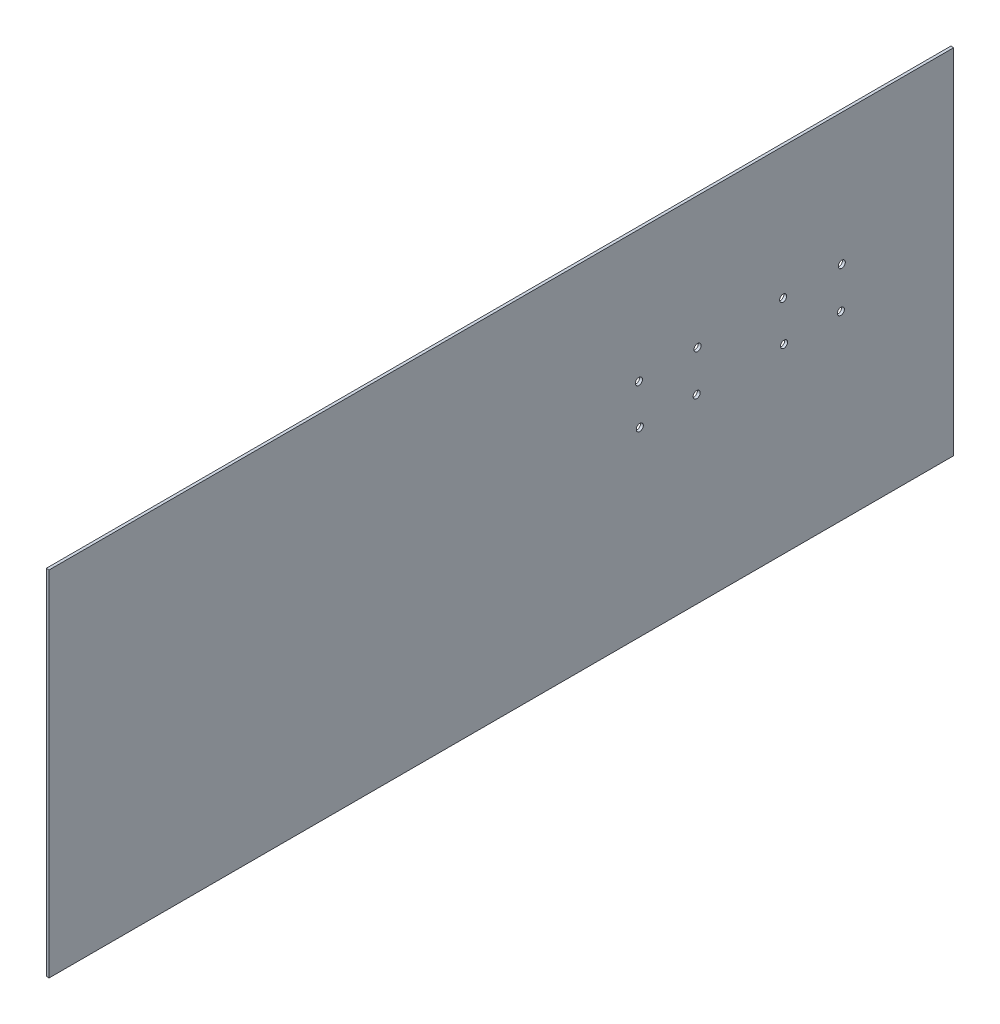
ISO-10303-21;
HEADER;
FILE_DESCRIPTION(('STEP AP214'),'2;1');
FILE_NAME('part.step','',(''),(''),'','','');
FILE_SCHEMA(('AUTOMOTIVE_DESIGN { 1 0 10303 214 1 1 1 1 }'));
ENDSEC;
DATA;
#1=APPLICATION_CONTEXT('core data for automotive mechanical design processes');
#2=APPLICATION_PROTOCOL_DEFINITION('international standard','automotive_design',2000,#1);
#3=PRODUCT_CONTEXT('',#1,'mechanical');
#4=PRODUCT('Part','Part','',(#3));
#5=PRODUCT_RELATED_PRODUCT_CATEGORY('part','',(#4));
#6=PRODUCT_DEFINITION_FORMATION('','',#4);
#7=PRODUCT_DEFINITION_CONTEXT('part definition',#1,'design');
#8=PRODUCT_DEFINITION('design','',#6,#7);
#9=PRODUCT_DEFINITION_SHAPE('','',#8);
#10=(LENGTH_UNIT() NAMED_UNIT(*) SI_UNIT(.MILLI.,.METRE.));
#11=(NAMED_UNIT(*) PLANE_ANGLE_UNIT() SI_UNIT($,.RADIAN.));
#12=(NAMED_UNIT(*) SI_UNIT($,.STERADIAN.) SOLID_ANGLE_UNIT());
#13=UNCERTAINTY_MEASURE_WITH_UNIT(LENGTH_MEASURE(1.E-05),#10,'distance_accuracy_value','');
#14=(GEOMETRIC_REPRESENTATION_CONTEXT(3) GLOBAL_UNCERTAINTY_ASSIGNED_CONTEXT((#13)) GLOBAL_UNIT_ASSIGNED_CONTEXT((#10,
#11,#12)) REPRESENTATION_CONTEXT('',''));
#15=CARTESIAN_POINT('',(0.,0.,0.));
#16=DIRECTION('',(0.,0.,1.));
#17=DIRECTION('',(1.,0.,0.));
#18=AXIS2_PLACEMENT_3D('',#15,#16,#17);
#19=CARTESIAN_POINT('',(2.,0.,0.));
#20=DIRECTION('',(1.,0.,0.));
#21=DIRECTION('',(0.,0.,-1.));
#22=AXIS2_PLACEMENT_3D('',#19,#20,#21);
#23=PLANE('',#22);
#24=CARTESIAN_POINT('',(2.,14.0702412568172,-241.389936391471));
#25=DIRECTION('',(1.,0.,0.));
#26=DIRECTION('',(0.,0.,-1.));
#27=AXIS2_PLACEMENT_3D('',#24,#25,#26);
#28=CIRCLE('',#27,2.5);
#29=CARTESIAN_POINT('',(2.,14.0702412568172,-243.889936391471));
#30=VERTEX_POINT('',#29);
#31=EDGE_CURVE('E145',#30,#30,#28,.T.);
#32=ORIENTED_EDGE('',*,*,#31,.F.);
#33=EDGE_LOOP('',(#32));
#34=FACE_BOUND('',#33,.T.);
#35=CARTESIAN_POINT('',(2.,42.6102412568172,-200.545763818368));
#36=DIRECTION('',(1.,0.,0.));
#37=DIRECTION('',(0.,0.,-1.));
#38=AXIS2_PLACEMENT_3D('',#35,#36,#37);
#39=CIRCLE('',#38,2.5);
#40=CARTESIAN_POINT('',(2.,42.6102412568172,-203.045763818368));
#41=VERTEX_POINT('',#40);
#42=EDGE_CURVE('E133',#41,#41,#39,.T.);
#43=ORIENTED_EDGE('',*,*,#42,.F.);
#44=EDGE_LOOP('',(#43));
#45=FACE_BOUND('',#44,.T.);
#46=CARTESIAN_POINT('',(2.,14.0702412568178,-99.1462512423402));
#47=DIRECTION('',(1.,0.,0.));
#48=DIRECTION('',(0.,0.,-1.));
#49=AXIS2_PLACEMENT_3D('',#46,#47,#48);
#50=CIRCLE('',#49,2.50000000000001);
#51=CARTESIAN_POINT('',(2.,14.0702412568178,-101.64625124234));
#52=VERTEX_POINT('',#51);
#53=EDGE_CURVE('E121',#52,#52,#50,.T.);
#54=ORIENTED_EDGE('',*,*,#53,.F.);
#55=EDGE_LOOP('',(#54));
#56=FACE_BOUND('',#55,.T.);
#57=CARTESIAN_POINT('',(2.,42.6102412568178,-98.5187323569636));
#58=DIRECTION('',(1.,0.,0.));
#59=DIRECTION('',(0.,0.,-1.));
#60=AXIS2_PLACEMENT_3D('',#57,#58,#59);
#61=CIRCLE('',#60,2.5);
#62=CARTESIAN_POINT('',(2.,42.6102412568178,-101.018732356964));
#63=VERTEX_POINT('',#62);
#64=EDGE_CURVE('E100',#63,#63,#61,.T.);
#65=ORIENTED_EDGE('',*,*,#64,.F.);
#66=EDGE_LOOP('',(#65));
#67=FACE_BOUND('',#66,.T.);
#68=DIRECTION('',(0.,-1.,0.));
#69=VECTOR('',#68,1.);
#70=CARTESIAN_POINT('',(2.,135.719844357977,318.75486381323));
#71=LINE('',#70,#69);
#72=CARTESIAN_POINT('',(2.,135.719844357977,318.75486381323));
#73=VERTEX_POINT('',#72);
#74=CARTESIAN_POINT('',(2.,-114.280155642023,318.75486381323));
#75=VERTEX_POINT('',#74);
#76=EDGE_CURVE('E85',#73,#75,#71,.T.);
#77=ORIENTED_EDGE('',*,*,#76,.T.);
#78=DIRECTION('',(0.,0.,-1.));
#79=VECTOR('',#78,1.);
#80=CARTESIAN_POINT('',(2.,-114.280155642023,318.75486381323));
#81=LINE('',#80,#79);
#82=CARTESIAN_POINT('',(2.,-114.280155642023,-321.24513618677));
#83=VERTEX_POINT('',#82);
#84=EDGE_CURVE('E80',#75,#83,#81,.T.);
#85=ORIENTED_EDGE('',*,*,#84,.T.);
#86=DIRECTION('',(0.,1.,0.));
#87=VECTOR('',#86,1.);
#88=CARTESIAN_POINT('',(2.,135.719844357977,-321.24513618677));
#89=LINE('',#88,#87);
#90=CARTESIAN_POINT('',(2.,135.719844357977,-321.24513618677));
#91=VERTEX_POINT('',#90);
#92=EDGE_CURVE('E83',#83,#91,#89,.T.);
#93=ORIENTED_EDGE('',*,*,#92,.T.);
#94=DIRECTION('',(0.,0.,1.));
#95=VECTOR('',#94,1.);
#96=CARTESIAN_POINT('',(2.,135.719844357977,318.75486381323));
#97=LINE('',#96,#95);
#98=EDGE_CURVE('E50',#91,#73,#97,.T.);
#99=ORIENTED_EDGE('',*,*,#98,.T.);
#100=EDGE_LOOP('',(#77,#85,#93,#99));
#101=FACE_BOUND('',#100,.T.);
#102=CARTESIAN_POINT('',(2.,42.6102412568178,-140.009766973042));
#103=DIRECTION('',(1.,0.,0.));
#104=DIRECTION('',(0.,0.,-1.));
#105=AXIS2_PLACEMENT_3D('',#102,#103,#104);
#106=CIRCLE('',#105,2.5);
#107=CARTESIAN_POINT('',(2.,42.6102412568178,-142.509766973042));
#108=VERTEX_POINT('',#107);
#109=EDGE_CURVE('E115',#108,#108,#106,.T.);
#110=ORIENTED_EDGE('',*,*,#109,.F.);
#111=EDGE_LOOP('',(#110));
#112=FACE_BOUND('',#111,.T.);
#113=CARTESIAN_POINT('',(2.,14.0702412568178,-139.362904930067));
#114=DIRECTION('',(1.,0.,0.));
#115=DIRECTION('',(0.,0.,-1.));
#116=AXIS2_PLACEMENT_3D('',#113,#114,#115);
#117=CIRCLE('',#116,2.5);
#118=CARTESIAN_POINT('',(2.,14.0702412568178,-141.862904930067));
#119=VERTEX_POINT('',#118);
#120=EDGE_CURVE('E127',#119,#119,#117,.T.);
#121=ORIENTED_EDGE('',*,*,#120,.F.);
#122=EDGE_LOOP('',(#121));
#123=FACE_BOUND('',#122,.T.);
#124=CARTESIAN_POINT('',(2.,14.0702412568172,-201.173282703744));
#125=DIRECTION('',(1.,0.,0.));
#126=DIRECTION('',(0.,0.,-1.));
#127=AXIS2_PLACEMENT_3D('',#124,#125,#126);
#128=CIRCLE('',#127,2.49999999999997);
#129=CARTESIAN_POINT('',(2.,14.0702412568172,-203.673282703744));
#130=VERTEX_POINT('',#129);
#131=EDGE_CURVE('E139',#130,#130,#128,.T.);
#132=ORIENTED_EDGE('',*,*,#131,.F.);
#133=EDGE_LOOP('',(#132));
#134=FACE_BOUND('',#133,.T.);
#135=CARTESIAN_POINT('',(2.,42.6102412568172,-242.036798434446));
#136=DIRECTION('',(1.,0.,0.));
#137=DIRECTION('',(0.,0.,-1.));
#138=AXIS2_PLACEMENT_3D('',#135,#136,#137);
#139=CIRCLE('',#138,2.5);
#140=CARTESIAN_POINT('',(2.,42.6102412568172,-244.536798434446));
#141=VERTEX_POINT('',#140);
#142=EDGE_CURVE('E151',#141,#141,#139,.T.);
#143=ORIENTED_EDGE('',*,*,#142,.F.);
#144=EDGE_LOOP('',(#143));
#145=FACE_BOUND('',#144,.T.);
#146=ADVANCED_FACE('F33',(#34,#45,#56,#67,#101,#112,#123,#134,#145),#23,.T.);
#147=CARTESIAN_POINT('',(0.,0.,0.));
#148=DIRECTION('',(1.,0.,0.));
#149=DIRECTION('',(0.,0.,-1.));
#150=AXIS2_PLACEMENT_3D('',#147,#148,#149);
#151=PLANE('',#150);
#152=DIRECTION('',(0.,-1.,0.));
#153=VECTOR('',#152,1.);
#154=CARTESIAN_POINT('',(0.,135.719844357977,318.75486381323));
#155=LINE('',#154,#153);
#156=CARTESIAN_POINT('',(0.,135.719844357977,318.75486381323));
#157=VERTEX_POINT('',#156);
#158=CARTESIAN_POINT('',(0.,-114.280155642023,318.75486381323));
#159=VERTEX_POINT('',#158);
#160=EDGE_CURVE('E97',#157,#159,#155,.T.);
#161=ORIENTED_EDGE('',*,*,#160,.F.);
#162=DIRECTION('',(0.,0.,1.));
#163=VECTOR('',#162,1.);
#164=CARTESIAN_POINT('',(0.,135.719844357977,318.75486381323));
#165=LINE('',#164,#163);
#166=CARTESIAN_POINT('',(0.,135.719844357977,-321.24513618677));
#167=VERTEX_POINT('',#166);
#168=EDGE_CURVE('E73',#167,#157,#165,.T.);
#169=ORIENTED_EDGE('',*,*,#168,.F.);
#170=DIRECTION('',(0.,1.,0.));
#171=VECTOR('',#170,1.);
#172=CARTESIAN_POINT('',(0.,135.719844357977,-321.24513618677));
#173=LINE('',#172,#171);
#174=CARTESIAN_POINT('',(0.,-114.280155642023,-321.24513618677));
#175=VERTEX_POINT('',#174);
#176=EDGE_CURVE('E67',#175,#167,#173,.T.);
#177=ORIENTED_EDGE('',*,*,#176,.F.);
#178=DIRECTION('',(0.,0.,-1.));
#179=VECTOR('',#178,1.);
#180=CARTESIAN_POINT('',(0.,-114.280155642023,318.75486381323));
#181=LINE('',#180,#179);
#182=EDGE_CURVE('E89',#159,#175,#181,.T.);
#183=ORIENTED_EDGE('',*,*,#182,.F.);
#184=EDGE_LOOP('',(#161,#169,#177,#183));
#185=FACE_BOUND('',#184,.T.);
#186=CARTESIAN_POINT('',(0.,42.6102412568178,-98.5187323569636));
#187=DIRECTION('',(1.,0.,0.));
#188=DIRECTION('',(0.,0.,-1.));
#189=AXIS2_PLACEMENT_3D('',#186,#187,#188);
#190=CIRCLE('',#189,2.5);
#191=CARTESIAN_POINT('',(0.,42.6102412568178,-101.018732356964));
#192=VERTEX_POINT('',#191);
#193=EDGE_CURVE('E112',#192,#192,#190,.T.);
#194=ORIENTED_EDGE('',*,*,#193,.T.);
#195=EDGE_LOOP('',(#194));
#196=FACE_BOUND('',#195,.T.);
#197=CARTESIAN_POINT('',(0.,42.6102412568178,-140.009766973042));
#198=DIRECTION('',(1.,0.,0.));
#199=DIRECTION('',(0.,0.,-1.));
#200=AXIS2_PLACEMENT_3D('',#197,#198,#199);
#201=CIRCLE('',#200,2.5);
#202=CARTESIAN_POINT('',(0.,42.6102412568178,-142.509766973042));
#203=VERTEX_POINT('',#202);
#204=EDGE_CURVE('E118',#203,#203,#201,.T.);
#205=ORIENTED_EDGE('',*,*,#204,.T.);
#206=EDGE_LOOP('',(#205));
#207=FACE_BOUND('',#206,.T.);
#208=CARTESIAN_POINT('',(0.,14.0702412568178,-99.1462512423402));
#209=DIRECTION('',(1.,0.,0.));
#210=DIRECTION('',(0.,0.,-1.));
#211=AXIS2_PLACEMENT_3D('',#208,#209,#210);
#212=CIRCLE('',#211,2.50000000000001);
#213=CARTESIAN_POINT('',(0.,14.0702412568178,-101.64625124234));
#214=VERTEX_POINT('',#213);
#215=EDGE_CURVE('E124',#214,#214,#212,.T.);
#216=ORIENTED_EDGE('',*,*,#215,.T.);
#217=EDGE_LOOP('',(#216));
#218=FACE_BOUND('',#217,.T.);
#219=CARTESIAN_POINT('',(0.,14.0702412568178,-139.362904930067));
#220=DIRECTION('',(1.,0.,0.));
#221=DIRECTION('',(0.,0.,-1.));
#222=AXIS2_PLACEMENT_3D('',#219,#220,#221);
#223=CIRCLE('',#222,2.5);
#224=CARTESIAN_POINT('',(0.,14.0702412568178,-141.862904930067));
#225=VERTEX_POINT('',#224);
#226=EDGE_CURVE('E130',#225,#225,#223,.T.);
#227=ORIENTED_EDGE('',*,*,#226,.T.);
#228=EDGE_LOOP('',(#227));
#229=FACE_BOUND('',#228,.T.);
#230=CARTESIAN_POINT('',(0.,42.6102412568172,-200.545763818368));
#231=DIRECTION('',(1.,0.,0.));
#232=DIRECTION('',(0.,0.,-1.));
#233=AXIS2_PLACEMENT_3D('',#230,#231,#232);
#234=CIRCLE('',#233,2.5);
#235=CARTESIAN_POINT('',(0.,42.6102412568172,-203.045763818368));
#236=VERTEX_POINT('',#235);
#237=EDGE_CURVE('E136',#236,#236,#234,.T.);
#238=ORIENTED_EDGE('',*,*,#237,.T.);
#239=EDGE_LOOP('',(#238));
#240=FACE_BOUND('',#239,.T.);
#241=CARTESIAN_POINT('',(0.,14.0702412568172,-201.173282703744));
#242=DIRECTION('',(1.,0.,0.));
#243=DIRECTION('',(0.,0.,-1.));
#244=AXIS2_PLACEMENT_3D('',#241,#242,#243);
#245=CIRCLE('',#244,2.49999999999997);
#246=CARTESIAN_POINT('',(0.,14.0702412568172,-203.673282703744));
#247=VERTEX_POINT('',#246);
#248=EDGE_CURVE('E142',#247,#247,#245,.T.);
#249=ORIENTED_EDGE('',*,*,#248,.T.);
#250=EDGE_LOOP('',(#249));
#251=FACE_BOUND('',#250,.T.);
#252=CARTESIAN_POINT('',(0.,14.0702412568172,-241.389936391471));
#253=DIRECTION('',(1.,0.,0.));
#254=DIRECTION('',(0.,0.,-1.));
#255=AXIS2_PLACEMENT_3D('',#252,#253,#254);
#256=CIRCLE('',#255,2.5);
#257=CARTESIAN_POINT('',(0.,14.0702412568172,-243.889936391471));
#258=VERTEX_POINT('',#257);
#259=EDGE_CURVE('E148',#258,#258,#256,.T.);
#260=ORIENTED_EDGE('',*,*,#259,.T.);
#261=EDGE_LOOP('',(#260));
#262=FACE_BOUND('',#261,.T.);
#263=CARTESIAN_POINT('',(0.,42.6102412568172,-242.036798434446));
#264=DIRECTION('',(1.,0.,0.));
#265=DIRECTION('',(0.,0.,-1.));
#266=AXIS2_PLACEMENT_3D('',#263,#264,#265);
#267=CIRCLE('',#266,2.5);
#268=CARTESIAN_POINT('',(0.,42.6102412568172,-244.536798434446));
#269=VERTEX_POINT('',#268);
#270=EDGE_CURVE('E154',#269,#269,#267,.T.);
#271=ORIENTED_EDGE('',*,*,#270,.T.);
#272=EDGE_LOOP('',(#271));
#273=FACE_BOUND('',#272,.T.);
#274=ADVANCED_FACE('F108',(#185,#196,#207,#218,#229,#240,#251,#262,#273),#151,.F.);
#275=CARTESIAN_POINT('',(2.,135.719844357977,318.75486381323));
#276=DIRECTION('',(0.,0.,-1.));
#277=DIRECTION('',(0.,1.,0.));
#278=AXIS2_PLACEMENT_3D('',#275,#276,#277);
#279=PLANE('',#278);
#280=ORIENTED_EDGE('',*,*,#160,.T.);
#281=DIRECTION('',(-1.,0.,0.));
#282=VECTOR('',#281,1.);
#283=CARTESIAN_POINT('',(2.,-114.280155642023,318.75486381323));
#284=LINE('',#283,#282);
#285=EDGE_CURVE('E11',#75,#159,#284,.T.);
#286=ORIENTED_EDGE('',*,*,#285,.F.);
#287=ORIENTED_EDGE('',*,*,#76,.F.);
#288=DIRECTION('',(-1.,0.,0.));
#289=VECTOR('',#288,1.);
#290=CARTESIAN_POINT('',(2.,135.719844357977,318.75486381323));
#291=LINE('',#290,#289);
#292=EDGE_CURVE('E93',#73,#157,#291,.T.);
#293=ORIENTED_EDGE('',*,*,#292,.T.);
#294=EDGE_LOOP('',(#280,#286,#287,#293));
#295=FACE_BOUND('',#294,.T.);
#296=ADVANCED_FACE('F35',(#295),#279,.F.);
#297=CARTESIAN_POINT('',(2.,-114.280155642023,318.75486381323));
#298=DIRECTION('',(0.,1.,0.));
#299=DIRECTION('',(0.,0.,1.));
#300=AXIS2_PLACEMENT_3D('',#297,#298,#299);
#301=PLANE('',#300);
#302=ORIENTED_EDGE('',*,*,#182,.T.);
#303=DIRECTION('',(-1.,0.,0.));
#304=VECTOR('',#303,1.);
#305=CARTESIAN_POINT('',(2.,-114.280155642023,-321.24513618677));
#306=LINE('',#305,#304);
#307=EDGE_CURVE('E42',#83,#175,#306,.T.);
#308=ORIENTED_EDGE('',*,*,#307,.F.);
#309=ORIENTED_EDGE('',*,*,#84,.F.);
#310=ORIENTED_EDGE('',*,*,#285,.T.);
#311=EDGE_LOOP('',(#302,#308,#309,#310));
#312=FACE_BOUND('',#311,.T.);
#313=ADVANCED_FACE('F88',(#312),#301,.F.);
#314=CARTESIAN_POINT('',(2.,135.719844357977,-321.24513618677));
#315=DIRECTION('',(0.,0.,1.));
#316=DIRECTION('',(1.,0.,0.));
#317=AXIS2_PLACEMENT_3D('',#314,#315,#316);
#318=PLANE('',#317);
#319=ORIENTED_EDGE('',*,*,#176,.T.);
#320=DIRECTION('',(-1.,0.,0.));
#321=VECTOR('',#320,1.);
#322=CARTESIAN_POINT('',(2.,135.719844357977,-321.24513618677));
#323=LINE('',#322,#321);
#324=EDGE_CURVE('E90',#91,#167,#323,.T.);
#325=ORIENTED_EDGE('',*,*,#324,.F.);
#326=ORIENTED_EDGE('',*,*,#92,.F.);
#327=ORIENTED_EDGE('',*,*,#307,.T.);
#328=EDGE_LOOP('',(#319,#325,#326,#327));
#329=FACE_BOUND('',#328,.T.);
#330=ADVANCED_FACE('F91',(#329),#318,.F.);
#331=CARTESIAN_POINT('',(2.,135.719844357977,318.75486381323));
#332=DIRECTION('',(0.,-1.,0.));
#333=DIRECTION('',(0.,0.,-1.));
#334=AXIS2_PLACEMENT_3D('',#331,#332,#333);
#335=PLANE('',#334);
#336=ORIENTED_EDGE('',*,*,#168,.T.);
#337=ORIENTED_EDGE('',*,*,#292,.F.);
#338=ORIENTED_EDGE('',*,*,#98,.F.);
#339=ORIENTED_EDGE('',*,*,#324,.T.);
#340=EDGE_LOOP('',(#336,#337,#338,#339));
#341=FACE_BOUND('',#340,.T.);
#342=ADVANCED_FACE('F105',(#341),#335,.F.);
#343=CARTESIAN_POINT('',(2.,42.6102412568178,-98.5187323569636));
#344=DIRECTION('',(-1.,0.,0.));
#345=DIRECTION('',(0.,0.,1.));
#346=AXIS2_PLACEMENT_3D('',#343,#344,#345);
#347=CYLINDRICAL_SURFACE('',#346,2.5);
#348=ORIENTED_EDGE('',*,*,#64,.T.);
#349=EDGE_LOOP('',(#348));
#350=FACE_BOUND('',#349,.T.);
#351=ORIENTED_EDGE('',*,*,#193,.F.);
#352=EDGE_LOOP('',(#351));
#353=FACE_BOUND('',#352,.T.);
#354=ADVANCED_FACE('F173',(#350,#353),#347,.F.);
#355=CARTESIAN_POINT('',(2.,42.6102412568178,-140.009766973042));
#356=DIRECTION('',(-1.,0.,0.));
#357=DIRECTION('',(0.,0.,1.));
#358=AXIS2_PLACEMENT_3D('',#355,#356,#357);
#359=CYLINDRICAL_SURFACE('',#358,2.5);
#360=ORIENTED_EDGE('',*,*,#109,.T.);
#361=EDGE_LOOP('',(#360));
#362=FACE_BOUND('',#361,.T.);
#363=ORIENTED_EDGE('',*,*,#204,.F.);
#364=EDGE_LOOP('',(#363));
#365=FACE_BOUND('',#364,.T.);
#366=ADVANCED_FACE('F219',(#362,#365),#359,.F.);
#367=CARTESIAN_POINT('',(2.,14.0702412568178,-99.1462512423402));
#368=DIRECTION('',(-1.,0.,0.));
#369=DIRECTION('',(0.,0.,1.));
#370=AXIS2_PLACEMENT_3D('',#367,#368,#369);
#371=CYLINDRICAL_SURFACE('',#370,2.50000000000001);
#372=ORIENTED_EDGE('',*,*,#53,.T.);
#373=EDGE_LOOP('',(#372));
#374=FACE_BOUND('',#373,.T.);
#375=ORIENTED_EDGE('',*,*,#215,.F.);
#376=EDGE_LOOP('',(#375));
#377=FACE_BOUND('',#376,.T.);
#378=ADVANCED_FACE('F227',(#374,#377),#371,.F.);
#379=CARTESIAN_POINT('',(2.,14.0702412568178,-139.362904930067));
#380=DIRECTION('',(-1.,0.,0.));
#381=DIRECTION('',(0.,0.,1.));
#382=AXIS2_PLACEMENT_3D('',#379,#380,#381);
#383=CYLINDRICAL_SURFACE('',#382,2.5);
#384=ORIENTED_EDGE('',*,*,#120,.T.);
#385=EDGE_LOOP('',(#384));
#386=FACE_BOUND('',#385,.T.);
#387=ORIENTED_EDGE('',*,*,#226,.F.);
#388=EDGE_LOOP('',(#387));
#389=FACE_BOUND('',#388,.T.);
#390=ADVANCED_FACE('F235',(#386,#389),#383,.F.);
#391=CARTESIAN_POINT('',(2.,42.6102412568172,-200.545763818368));
#392=DIRECTION('',(-1.,0.,0.));
#393=DIRECTION('',(0.,0.,1.));
#394=AXIS2_PLACEMENT_3D('',#391,#392,#393);
#395=CYLINDRICAL_SURFACE('',#394,2.5);
#396=ORIENTED_EDGE('',*,*,#42,.T.);
#397=EDGE_LOOP('',(#396));
#398=FACE_BOUND('',#397,.T.);
#399=ORIENTED_EDGE('',*,*,#237,.F.);
#400=EDGE_LOOP('',(#399));
#401=FACE_BOUND('',#400,.T.);
#402=ADVANCED_FACE('F244',(#398,#401),#395,.F.);
#403=CARTESIAN_POINT('',(2.,14.0702412568172,-201.173282703744));
#404=DIRECTION('',(-1.,0.,0.));
#405=DIRECTION('',(0.,0.,1.));
#406=AXIS2_PLACEMENT_3D('',#403,#404,#405);
#407=CYLINDRICAL_SURFACE('',#406,2.49999999999997);
#408=ORIENTED_EDGE('',*,*,#131,.T.);
#409=EDGE_LOOP('',(#408));
#410=FACE_BOUND('',#409,.T.);
#411=ORIENTED_EDGE('',*,*,#248,.F.);
#412=EDGE_LOOP('',(#411));
#413=FACE_BOUND('',#412,.T.);
#414=ADVANCED_FACE('F253',(#410,#413),#407,.F.);
#415=CARTESIAN_POINT('',(2.,14.0702412568172,-241.389936391471));
#416=DIRECTION('',(-1.,0.,0.));
#417=DIRECTION('',(0.,0.,1.));
#418=AXIS2_PLACEMENT_3D('',#415,#416,#417);
#419=CYLINDRICAL_SURFACE('',#418,2.5);
#420=ORIENTED_EDGE('',*,*,#31,.T.);
#421=EDGE_LOOP('',(#420));
#422=FACE_BOUND('',#421,.T.);
#423=ORIENTED_EDGE('',*,*,#259,.F.);
#424=EDGE_LOOP('',(#423));
#425=FACE_BOUND('',#424,.T.);
#426=ADVANCED_FACE('F262',(#422,#425),#419,.F.);
#427=CARTESIAN_POINT('',(2.,42.6102412568172,-242.036798434446));
#428=DIRECTION('',(-1.,0.,0.));
#429=DIRECTION('',(0.,0.,1.));
#430=AXIS2_PLACEMENT_3D('',#427,#428,#429);
#431=CYLINDRICAL_SURFACE('',#430,2.5);
#432=ORIENTED_EDGE('',*,*,#142,.T.);
#433=EDGE_LOOP('',(#432));
#434=FACE_BOUND('',#433,.T.);
#435=ORIENTED_EDGE('',*,*,#270,.F.);
#436=EDGE_LOOP('',(#435));
#437=FACE_BOUND('',#436,.T.);
#438=ADVANCED_FACE('F160',(#434,#437),#431,.F.);
#439=CLOSED_SHELL('',(#146,#274,#296,#313,#330,#342,#354,#366,#378,#390,#402,#414,#426,#438));
#440=MANIFOLD_SOLID_BREP('B2',#439);
#441=ADVANCED_BREP_SHAPE_REPRESENTATION('',(#18,#440),#14);
#442=SHAPE_DEFINITION_REPRESENTATION(#9,#441);
ENDSEC;
END-ISO-10303-21;
